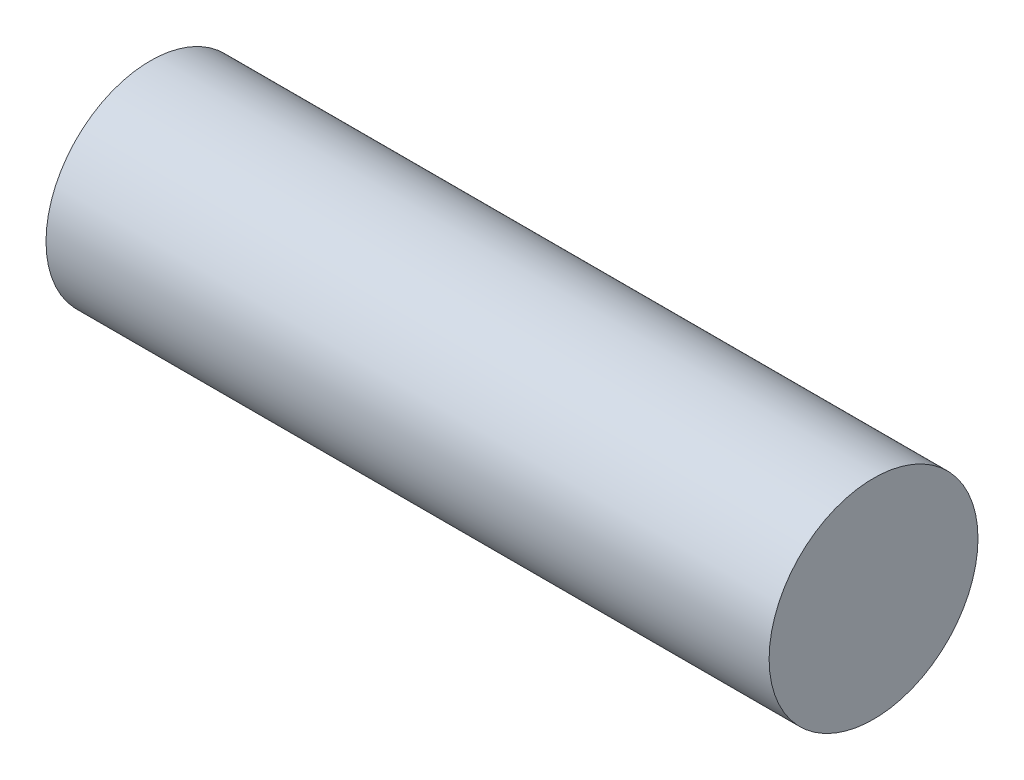
ISO-10303-21;
HEADER;
FILE_DESCRIPTION(('STEP AP214'),'2;1');
FILE_NAME('part.step','',(''),(''),'','','');
FILE_SCHEMA(('AUTOMOTIVE_DESIGN { 1 0 10303 214 1 1 1 1 }'));
ENDSEC;
DATA;
#1=APPLICATION_CONTEXT('core data for automotive mechanical design processes');
#2=APPLICATION_PROTOCOL_DEFINITION('international standard','automotive_design',2000,#1);
#3=PRODUCT_CONTEXT('',#1,'mechanical');
#4=PRODUCT('Part','Part','',(#3));
#5=PRODUCT_RELATED_PRODUCT_CATEGORY('part','',(#4));
#6=PRODUCT_DEFINITION_FORMATION('','',#4);
#7=PRODUCT_DEFINITION_CONTEXT('part definition',#1,'design');
#8=PRODUCT_DEFINITION('design','',#6,#7);
#9=PRODUCT_DEFINITION_SHAPE('','',#8);
#10=(LENGTH_UNIT() NAMED_UNIT(*) SI_UNIT(.MILLI.,.METRE.));
#11=(NAMED_UNIT(*) PLANE_ANGLE_UNIT() SI_UNIT($,.RADIAN.));
#12=(NAMED_UNIT(*) SI_UNIT($,.STERADIAN.) SOLID_ANGLE_UNIT());
#13=UNCERTAINTY_MEASURE_WITH_UNIT(LENGTH_MEASURE(1.E-05),#10,'distance_accuracy_value','');
#14=(GEOMETRIC_REPRESENTATION_CONTEXT(3) GLOBAL_UNCERTAINTY_ASSIGNED_CONTEXT((#13)) GLOBAL_UNIT_ASSIGNED_CONTEXT((#10,
#11,#12)) REPRESENTATION_CONTEXT('',''));
#15=CARTESIAN_POINT('',(0.,0.,0.));
#16=DIRECTION('',(0.,0.,1.));
#17=DIRECTION('',(1.,0.,0.));
#18=AXIS2_PLACEMENT_3D('',#15,#16,#17);
#19=CARTESIAN_POINT('',(9.,0.,0.));
#20=DIRECTION('',(-1.,0.,0.));
#21=DIRECTION('',(0.,0.,1.));
#22=AXIS2_PLACEMENT_3D('',#19,#20,#21);
#23=CYLINDRICAL_SURFACE('',#22,2.6);
#24=CARTESIAN_POINT('',(9.,0.,0.));
#25=DIRECTION('',(1.,0.,0.));
#26=DIRECTION('',(0.,0.,-1.));
#27=AXIS2_PLACEMENT_3D('',#24,#25,#26);
#28=CIRCLE('',#27,2.6);
#29=CARTESIAN_POINT('',(9.,0.,-2.6));
#30=VERTEX_POINT('',#29);
#31=EDGE_CURVE('E10',#30,#30,#28,.T.);
#32=ORIENTED_EDGE('',*,*,#31,.F.);
#33=EDGE_LOOP('',(#32));
#34=FACE_BOUND('',#33,.T.);
#35=CARTESIAN_POINT('',(-9.,0.,0.));
#36=DIRECTION('',(1.,0.,0.));
#37=DIRECTION('',(0.,0.,-1.));
#38=AXIS2_PLACEMENT_3D('',#35,#36,#37);
#39=CIRCLE('',#38,2.6);
#40=CARTESIAN_POINT('',(-9.,0.,-2.6));
#41=VERTEX_POINT('',#40);
#42=EDGE_CURVE('E33',#41,#41,#39,.T.);
#43=ORIENTED_EDGE('',*,*,#42,.T.);
#44=EDGE_LOOP('',(#43));
#45=FACE_BOUND('',#44,.T.);
#46=ADVANCED_FACE('F30',(#34,#45),#23,.T.);
#47=CARTESIAN_POINT('',(9.,0.,0.));
#48=DIRECTION('',(1.,0.,0.));
#49=DIRECTION('',(0.,0.,-1.));
#50=AXIS2_PLACEMENT_3D('',#47,#48,#49);
#51=PLANE('',#50);
#52=ORIENTED_EDGE('',*,*,#31,.T.);
#53=EDGE_LOOP('',(#52));
#54=FACE_BOUND('',#53,.T.);
#55=ADVANCED_FACE('F45',(#54),#51,.T.);
#56=CARTESIAN_POINT('',(-9.,0.,0.));
#57=DIRECTION('',(1.,0.,0.));
#58=DIRECTION('',(0.,0.,-1.));
#59=AXIS2_PLACEMENT_3D('',#56,#57,#58);
#60=PLANE('',#59);
#61=ORIENTED_EDGE('',*,*,#42,.F.);
#62=EDGE_LOOP('',(#61));
#63=FACE_BOUND('',#62,.T.);
#64=ADVANCED_FACE('F43',(#63),#60,.F.);
#65=CLOSED_SHELL('',(#46,#55,#64));
#66=MANIFOLD_SOLID_BREP('B2',#65);
#67=ADVANCED_BREP_SHAPE_REPRESENTATION('',(#18,#66),#14);
#68=SHAPE_DEFINITION_REPRESENTATION(#9,#67);
ENDSEC;
END-ISO-10303-21;
